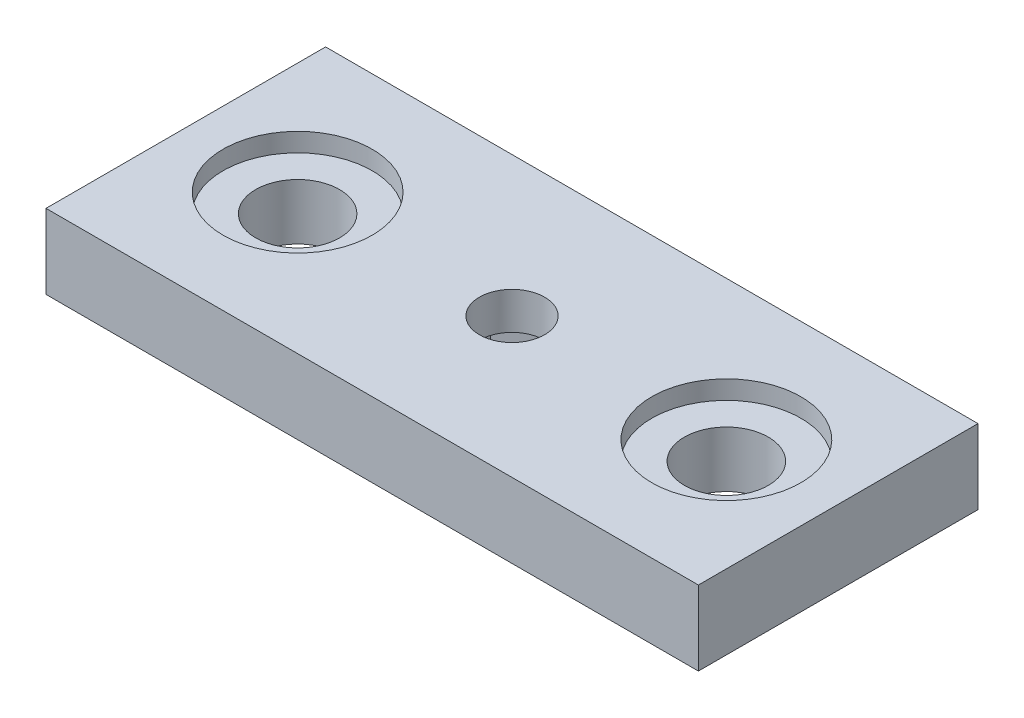
ISO-10303-21;
HEADER;
FILE_DESCRIPTION(('STEP AP214'),'2;1');
FILE_NAME('part.step','',(''),(''),'','','');
FILE_SCHEMA(('AUTOMOTIVE_DESIGN { 1 0 10303 214 1 1 1 1 }'));
ENDSEC;
DATA;
#1=APPLICATION_CONTEXT('core data for automotive mechanical design processes');
#2=APPLICATION_PROTOCOL_DEFINITION('international standard','automotive_design',2000,#1);
#3=PRODUCT_CONTEXT('',#1,'mechanical');
#4=PRODUCT('Part','Part','',(#3));
#5=PRODUCT_RELATED_PRODUCT_CATEGORY('part','',(#4));
#6=PRODUCT_DEFINITION_FORMATION('','',#4);
#7=PRODUCT_DEFINITION_CONTEXT('part definition',#1,'design');
#8=PRODUCT_DEFINITION('design','',#6,#7);
#9=PRODUCT_DEFINITION_SHAPE('','',#8);
#10=(LENGTH_UNIT() NAMED_UNIT(*) SI_UNIT(.MILLI.,.METRE.));
#11=(NAMED_UNIT(*) PLANE_ANGLE_UNIT() SI_UNIT($,.RADIAN.));
#12=(NAMED_UNIT(*) SI_UNIT($,.STERADIAN.) SOLID_ANGLE_UNIT());
#13=UNCERTAINTY_MEASURE_WITH_UNIT(LENGTH_MEASURE(1.E-05),#10,'distance_accuracy_value','');
#14=(GEOMETRIC_REPRESENTATION_CONTEXT(3) GLOBAL_UNCERTAINTY_ASSIGNED_CONTEXT((#13)) GLOBAL_UNIT_ASSIGNED_CONTEXT((#10,
#11,#12)) REPRESENTATION_CONTEXT('',''));
#15=CARTESIAN_POINT('',(0.,0.,0.));
#16=DIRECTION('',(0.,0.,1.));
#17=DIRECTION('',(1.,0.,0.));
#18=AXIS2_PLACEMENT_3D('',#15,#16,#17);
#19=CARTESIAN_POINT('',(17.5,4.,-7.5));
#20=DIRECTION('',(0.,1.,0.));
#21=DIRECTION('',(0.,0.,1.));
#22=AXIS2_PLACEMENT_3D('',#19,#20,#21);
#23=CYLINDRICAL_SURFACE('',#22,1.74999999999999);
#24=CARTESIAN_POINT('',(17.5,4.,-7.5));
#25=DIRECTION('',(0.,1.,0.));
#26=DIRECTION('',(0.,0.,1.));
#27=AXIS2_PLACEMENT_3D('',#24,#25,#26);
#28=CIRCLE('',#27,1.74999999999999);
#29=CARTESIAN_POINT('',(17.5,4.,-5.75000000000001));
#30=VERTEX_POINT('',#29);
#31=EDGE_CURVE('E200',#30,#30,#28,.T.);
#32=ORIENTED_EDGE('',*,*,#31,.T.);
#33=EDGE_LOOP('',(#32));
#34=FACE_BOUND('',#33,.T.);
#35=CARTESIAN_POINT('',(17.5,2.,-7.5));
#36=DIRECTION('',(0.,-1.,0.));
#37=DIRECTION('',(0.,0.,-1.));
#38=AXIS2_PLACEMENT_3D('',#35,#36,#37);
#39=CIRCLE('',#38,1.74999999999999);
#40=CARTESIAN_POINT('',(17.5,2.,-9.24999999999999));
#41=VERTEX_POINT('',#40);
#42=EDGE_CURVE('E38',#41,#41,#39,.F.);
#43=ORIENTED_EDGE('',*,*,#42,.F.);
#44=EDGE_LOOP('',(#43));
#45=FACE_BOUND('',#44,.T.);
#46=ADVANCED_FACE('F34',(#34,#45),#23,.F.);
#47=CARTESIAN_POINT('',(0.,4.,0.));
#48=DIRECTION('',(1.,0.,0.));
#49=DIRECTION('',(0.,0.,-1.));
#50=AXIS2_PLACEMENT_3D('',#47,#48,#49);
#51=PLANE('',#50);
#52=DIRECTION('',(0.,0.,1.));
#53=VECTOR('',#52,1.);
#54=CARTESIAN_POINT('',(0.,0.,0.));
#55=LINE('',#54,#53);
#56=CARTESIAN_POINT('',(0.,0.,-15.));
#57=VERTEX_POINT('',#56);
#58=CARTESIAN_POINT('',(0.,0.,0.));
#59=VERTEX_POINT('',#58);
#60=EDGE_CURVE('E203',#57,#59,#55,.T.);
#61=ORIENTED_EDGE('',*,*,#60,.T.);
#62=DIRECTION('',(0.,-1.,0.));
#63=VECTOR('',#62,1.);
#64=CARTESIAN_POINT('',(0.,4.,0.));
#65=LINE('',#64,#63);
#66=CARTESIAN_POINT('',(0.,4.,0.));
#67=VERTEX_POINT('',#66);
#68=EDGE_CURVE('E11',#67,#59,#65,.T.);
#69=ORIENTED_EDGE('',*,*,#68,.F.);
#70=DIRECTION('',(0.,0.,1.));
#71=VECTOR('',#70,1.);
#72=CARTESIAN_POINT('',(0.,4.,0.));
#73=LINE('',#72,#71);
#74=CARTESIAN_POINT('',(0.,4.,-15.));
#75=VERTEX_POINT('',#74);
#76=EDGE_CURVE('E204',#75,#67,#73,.T.);
#77=ORIENTED_EDGE('',*,*,#76,.F.);
#78=DIRECTION('',(0.,-1.,0.));
#79=VECTOR('',#78,1.);
#80=CARTESIAN_POINT('',(0.,4.,-15.));
#81=LINE('',#80,#79);
#82=EDGE_CURVE('E210',#75,#57,#81,.T.);
#83=ORIENTED_EDGE('',*,*,#82,.T.);
#84=EDGE_LOOP('',(#61,#69,#77,#83));
#85=FACE_BOUND('',#84,.T.);
#86=ADVANCED_FACE('F36',(#85),#51,.F.);
#87=CARTESIAN_POINT('',(0.,4.,0.));
#88=DIRECTION('',(0.,0.,-1.));
#89=DIRECTION('',(-1.,0.,0.));
#90=AXIS2_PLACEMENT_3D('',#87,#88,#89);
#91=PLANE('',#90);
#92=DIRECTION('',(1.,0.,0.));
#93=VECTOR('',#92,1.);
#94=CARTESIAN_POINT('',(0.,0.,0.));
#95=LINE('',#94,#93);
#96=CARTESIAN_POINT('',(35.,0.,0.));
#97=VERTEX_POINT('',#96);
#98=EDGE_CURVE('E213',#59,#97,#95,.T.);
#99=ORIENTED_EDGE('',*,*,#98,.T.);
#100=DIRECTION('',(0.,-1.,0.));
#101=VECTOR('',#100,1.);
#102=CARTESIAN_POINT('',(35.,4.,0.));
#103=LINE('',#102,#101);
#104=CARTESIAN_POINT('',(35.,4.,0.));
#105=VERTEX_POINT('',#104);
#106=EDGE_CURVE('E43',#105,#97,#103,.T.);
#107=ORIENTED_EDGE('',*,*,#106,.F.);
#108=DIRECTION('',(1.,0.,0.));
#109=VECTOR('',#108,1.);
#110=CARTESIAN_POINT('',(0.,4.,0.));
#111=LINE('',#110,#109);
#112=EDGE_CURVE('E87',#67,#105,#111,.T.);
#113=ORIENTED_EDGE('',*,*,#112,.F.);
#114=ORIENTED_EDGE('',*,*,#68,.T.);
#115=EDGE_LOOP('',(#99,#107,#113,#114));
#116=FACE_BOUND('',#115,.T.);
#117=ADVANCED_FACE('F243',(#116),#91,.F.);
#118=CARTESIAN_POINT('',(35.,4.,0.));
#119=DIRECTION('',(-1.,0.,0.));
#120=DIRECTION('',(0.,0.,1.));
#121=AXIS2_PLACEMENT_3D('',#118,#119,#120);
#122=PLANE('',#121);
#123=DIRECTION('',(0.,0.,-1.));
#124=VECTOR('',#123,1.);
#125=CARTESIAN_POINT('',(35.,0.,0.));
#126=LINE('',#125,#124);
#127=CARTESIAN_POINT('',(35.,0.,-15.));
#128=VERTEX_POINT('',#127);
#129=EDGE_CURVE('E215',#97,#128,#126,.T.);
#130=ORIENTED_EDGE('',*,*,#129,.T.);
#131=DIRECTION('',(0.,-1.,0.));
#132=VECTOR('',#131,1.);
#133=CARTESIAN_POINT('',(35.,4.,-15.));
#134=LINE('',#133,#132);
#135=CARTESIAN_POINT('',(35.,4.,-15.));
#136=VERTEX_POINT('',#135);
#137=EDGE_CURVE('E219',#136,#128,#134,.T.);
#138=ORIENTED_EDGE('',*,*,#137,.F.);
#139=DIRECTION('',(0.,0.,-1.));
#140=VECTOR('',#139,1.);
#141=CARTESIAN_POINT('',(35.,4.,0.));
#142=LINE('',#141,#140);
#143=EDGE_CURVE('E207',#105,#136,#142,.T.);
#144=ORIENTED_EDGE('',*,*,#143,.F.);
#145=ORIENTED_EDGE('',*,*,#106,.T.);
#146=EDGE_LOOP('',(#130,#138,#144,#145));
#147=FACE_BOUND('',#146,.T.);
#148=ADVANCED_FACE('F225',(#147),#122,.F.);
#149=CARTESIAN_POINT('',(0.,4.,-15.));
#150=DIRECTION('',(0.,0.,1.));
#151=DIRECTION('',(1.,0.,0.));
#152=AXIS2_PLACEMENT_3D('',#149,#150,#151);
#153=PLANE('',#152);
#154=DIRECTION('',(-1.,0.,0.));
#155=VECTOR('',#154,1.);
#156=CARTESIAN_POINT('',(0.,0.,-15.));
#157=LINE('',#156,#155);
#158=EDGE_CURVE('E80',#128,#57,#157,.T.);
#159=ORIENTED_EDGE('',*,*,#158,.T.);
#160=ORIENTED_EDGE('',*,*,#82,.F.);
#161=DIRECTION('',(-1.,0.,0.));
#162=VECTOR('',#161,1.);
#163=CARTESIAN_POINT('',(0.,4.,-15.));
#164=LINE('',#163,#162);
#165=EDGE_CURVE('E59',#136,#75,#164,.T.);
#166=ORIENTED_EDGE('',*,*,#165,.F.);
#167=ORIENTED_EDGE('',*,*,#137,.T.);
#168=EDGE_LOOP('',(#159,#160,#166,#167));
#169=FACE_BOUND('',#168,.T.);
#170=ADVANCED_FACE('F233',(#169),#153,.F.);
#171=CARTESIAN_POINT('',(0.,4.,0.));
#172=DIRECTION('',(0.,-1.,0.));
#173=DIRECTION('',(0.,0.,-1.));
#174=AXIS2_PLACEMENT_3D('',#171,#172,#173);
#175=PLANE('',#174);
#176=CARTESIAN_POINT('',(6.,4.,-7.5));
#177=DIRECTION('',(0.,1.,0.));
#178=DIRECTION('',(0.,0.,1.));
#179=AXIS2_PLACEMENT_3D('',#176,#177,#178);
#180=CIRCLE('',#179,4.);
#181=CARTESIAN_POINT('',(6.,4.,-3.5));
#182=VERTEX_POINT('',#181);
#183=EDGE_CURVE('E176',#182,#182,#180,.T.);
#184=ORIENTED_EDGE('',*,*,#183,.F.);
#185=EDGE_LOOP('',(#184));
#186=FACE_BOUND('',#185,.T.);
#187=CARTESIAN_POINT('',(29.,4.,-7.5));
#188=DIRECTION('',(0.,1.,0.));
#189=DIRECTION('',(0.,0.,1.));
#190=AXIS2_PLACEMENT_3D('',#187,#188,#189);
#191=CIRCLE('',#190,4.);
#192=CARTESIAN_POINT('',(29.,4.,-3.5));
#193=VERTEX_POINT('',#192);
#194=EDGE_CURVE('E188',#193,#193,#191,.T.);
#195=ORIENTED_EDGE('',*,*,#194,.F.);
#196=EDGE_LOOP('',(#195));
#197=FACE_BOUND('',#196,.T.);
#198=ORIENTED_EDGE('',*,*,#31,.F.);
#199=EDGE_LOOP('',(#198));
#200=FACE_BOUND('',#199,.T.);
#201=ORIENTED_EDGE('',*,*,#76,.T.);
#202=ORIENTED_EDGE('',*,*,#112,.T.);
#203=ORIENTED_EDGE('',*,*,#143,.T.);
#204=ORIENTED_EDGE('',*,*,#165,.T.);
#205=EDGE_LOOP('',(#201,#202,#203,#204));
#206=FACE_BOUND('',#205,.T.);
#207=ADVANCED_FACE('F235',(#186,#197,#200,#206),#175,.F.);
#208=CARTESIAN_POINT('',(0.,0.,0.));
#209=DIRECTION('',(0.,-1.,0.));
#210=DIRECTION('',(0.,0.,-1.));
#211=AXIS2_PLACEMENT_3D('',#208,#209,#210);
#212=PLANE('',#211);
#213=DIRECTION('',(0.866025403784438,0.,-0.5));
#214=VECTOR('',#213,1.);
#215=CARTESIAN_POINT('',(14.75,0.,-9.08771324027147));
#216=LINE('',#215,#214);
#217=CARTESIAN_POINT('',(14.75,0.,-9.08771324027147));
#218=VERTEX_POINT('',#217);
#219=CARTESIAN_POINT('',(17.5,0.,-10.6754264805429));
#220=VERTEX_POINT('',#219);
#221=EDGE_CURVE('E50',#218,#220,#216,.T.);
#222=ORIENTED_EDGE('',*,*,#221,.F.);
#223=DIRECTION('',(0.,0.,-1.));
#224=VECTOR('',#223,1.);
#225=CARTESIAN_POINT('',(14.75,0.,-5.91228675972853));
#226=LINE('',#225,#224);
#227=CARTESIAN_POINT('',(14.75,0.,-5.91228675972853));
#228=VERTEX_POINT('',#227);
#229=EDGE_CURVE('E143',#228,#218,#226,.T.);
#230=ORIENTED_EDGE('',*,*,#229,.F.);
#231=DIRECTION('',(-0.866025403784439,0.,-0.5));
#232=VECTOR('',#231,1.);
#233=CARTESIAN_POINT('',(17.5,0.,-4.32457351945706));
#234=LINE('',#233,#232);
#235=CARTESIAN_POINT('',(17.5,0.,-4.32457351945706));
#236=VERTEX_POINT('',#235);
#237=EDGE_CURVE('E146',#236,#228,#234,.T.);
#238=ORIENTED_EDGE('',*,*,#237,.F.);
#239=DIRECTION('',(-0.866025403784439,0.,0.5));
#240=VECTOR('',#239,1.);
#241=CARTESIAN_POINT('',(20.25,0.,-5.91228675972853));
#242=LINE('',#241,#240);
#243=CARTESIAN_POINT('',(20.25,0.,-5.91228675972853));
#244=VERTEX_POINT('',#243);
#245=EDGE_CURVE('E162',#244,#236,#242,.T.);
#246=ORIENTED_EDGE('',*,*,#245,.F.);
#247=DIRECTION('',(0.,0.,1.));
#248=VECTOR('',#247,1.);
#249=CARTESIAN_POINT('',(20.25,0.,-9.08771324027147));
#250=LINE('',#249,#248);
#251=CARTESIAN_POINT('',(20.25,0.,-9.08771324027147));
#252=VERTEX_POINT('',#251);
#253=EDGE_CURVE('E159',#252,#244,#250,.T.);
#254=ORIENTED_EDGE('',*,*,#253,.F.);
#255=DIRECTION('',(0.866025403784439,0.,0.5));
#256=VECTOR('',#255,1.);
#257=CARTESIAN_POINT('',(17.5,0.,-10.6754264805429));
#258=LINE('',#257,#256);
#259=EDGE_CURVE('E157',#220,#252,#258,.T.);
#260=ORIENTED_EDGE('',*,*,#259,.F.);
#261=EDGE_LOOP('',(#222,#230,#238,#246,#254,#260));
#262=FACE_BOUND('',#261,.T.);
#263=CARTESIAN_POINT('',(6.,0.,-7.5));
#264=DIRECTION('',(0.,1.,0.));
#265=DIRECTION('',(0.,0.,1.));
#266=AXIS2_PLACEMENT_3D('',#263,#264,#265);
#267=CIRCLE('',#266,2.25);
#268=CARTESIAN_POINT('',(6.,0.,-5.25));
#269=VERTEX_POINT('',#268);
#270=EDGE_CURVE('E185',#269,#269,#267,.T.);
#271=ORIENTED_EDGE('',*,*,#270,.T.);
#272=EDGE_LOOP('',(#271));
#273=FACE_BOUND('',#272,.T.);
#274=CARTESIAN_POINT('',(29.,0.,-7.5));
#275=DIRECTION('',(0.,1.,0.));
#276=DIRECTION('',(0.,0.,1.));
#277=AXIS2_PLACEMENT_3D('',#274,#275,#276);
#278=CIRCLE('',#277,2.25);
#279=CARTESIAN_POINT('',(29.,0.,-5.25));
#280=VERTEX_POINT('',#279);
#281=EDGE_CURVE('E197',#280,#280,#278,.T.);
#282=ORIENTED_EDGE('',*,*,#281,.T.);
#283=EDGE_LOOP('',(#282));
#284=FACE_BOUND('',#283,.T.);
#285=ORIENTED_EDGE('',*,*,#60,.F.);
#286=ORIENTED_EDGE('',*,*,#158,.F.);
#287=ORIENTED_EDGE('',*,*,#129,.F.);
#288=ORIENTED_EDGE('',*,*,#98,.F.);
#289=EDGE_LOOP('',(#285,#286,#287,#288));
#290=FACE_BOUND('',#289,.T.);
#291=ADVANCED_FACE('F229',(#262,#273,#284,#290),#212,.T.);
#292=CARTESIAN_POINT('',(29.,4.,-7.5));
#293=DIRECTION('',(0.,1.,0.));
#294=DIRECTION('',(0.,0.,1.));
#295=AXIS2_PLACEMENT_3D('',#292,#293,#294);
#296=CYLINDRICAL_SURFACE('',#295,2.25000000000001);
#297=ORIENTED_EDGE('',*,*,#281,.F.);
#298=EDGE_LOOP('',(#297));
#299=FACE_BOUND('',#298,.T.);
#300=CARTESIAN_POINT('',(29.,3.00000000000005,-7.5));
#301=DIRECTION('',(0.,1.,0.));
#302=DIRECTION('',(0.,0.,1.));
#303=AXIS2_PLACEMENT_3D('',#300,#301,#302);
#304=CIRCLE('',#303,2.25000000000001);
#305=CARTESIAN_POINT('',(29.,3.00000000000005,-5.24999999999999));
#306=VERTEX_POINT('',#305);
#307=EDGE_CURVE('E194',#306,#306,#304,.T.);
#308=ORIENTED_EDGE('',*,*,#307,.T.);
#309=EDGE_LOOP('',(#308));
#310=FACE_BOUND('',#309,.T.);
#311=ADVANCED_FACE('F254',(#299,#310),#296,.F.);
#312=CARTESIAN_POINT('',(31.25,3.00000000000003,-7.5));
#313=DIRECTION('',(0.,-1.,0.));
#314=DIRECTION('',(0.,0.,-1.));
#315=AXIS2_PLACEMENT_3D('',#312,#313,#314);
#316=PLANE('',#315);
#317=ORIENTED_EDGE('',*,*,#307,.F.);
#318=EDGE_LOOP('',(#317));
#319=FACE_BOUND('',#318,.T.);
#320=CARTESIAN_POINT('',(29.,3.,-7.5));
#321=DIRECTION('',(0.,1.,0.));
#322=DIRECTION('',(0.,0.,1.));
#323=AXIS2_PLACEMENT_3D('',#320,#321,#322);
#324=CIRCLE('',#323,4.);
#325=CARTESIAN_POINT('',(29.,3.,-3.5));
#326=VERTEX_POINT('',#325);
#327=EDGE_CURVE('E191',#326,#326,#324,.T.);
#328=ORIENTED_EDGE('',*,*,#327,.T.);
#329=EDGE_LOOP('',(#328));
#330=FACE_BOUND('',#329,.T.);
#331=ADVANCED_FACE('F261',(#319,#330),#316,.F.);
#332=CARTESIAN_POINT('',(29.,4.,-7.5));
#333=DIRECTION('',(0.,1.,0.));
#334=DIRECTION('',(0.,0.,1.));
#335=AXIS2_PLACEMENT_3D('',#332,#333,#334);
#336=CYLINDRICAL_SURFACE('',#335,4.);
#337=ORIENTED_EDGE('',*,*,#327,.F.);
#338=EDGE_LOOP('',(#337));
#339=FACE_BOUND('',#338,.T.);
#340=ORIENTED_EDGE('',*,*,#194,.T.);
#341=EDGE_LOOP('',(#340));
#342=FACE_BOUND('',#341,.T.);
#343=ADVANCED_FACE('F273',(#339,#342),#336,.F.);
#344=CARTESIAN_POINT('',(6.,4.,-7.5));
#345=DIRECTION('',(0.,1.,0.));
#346=DIRECTION('',(0.,0.,1.));
#347=AXIS2_PLACEMENT_3D('',#344,#345,#346);
#348=CYLINDRICAL_SURFACE('',#347,2.25);
#349=ORIENTED_EDGE('',*,*,#270,.F.);
#350=EDGE_LOOP('',(#349));
#351=FACE_BOUND('',#350,.T.);
#352=CARTESIAN_POINT('',(6.,3.00000000000005,-7.5));
#353=DIRECTION('',(0.,1.,0.));
#354=DIRECTION('',(0.,0.,1.));
#355=AXIS2_PLACEMENT_3D('',#352,#353,#354);
#356=CIRCLE('',#355,2.25000000000001);
#357=CARTESIAN_POINT('',(6.,3.00000000000005,-5.24999999999999));
#358=VERTEX_POINT('',#357);
#359=EDGE_CURVE('E182',#358,#358,#356,.T.);
#360=ORIENTED_EDGE('',*,*,#359,.T.);
#361=EDGE_LOOP('',(#360));
#362=FACE_BOUND('',#361,.T.);
#363=ADVANCED_FACE('F278',(#351,#362),#348,.F.);
#364=CARTESIAN_POINT('',(8.25000000000001,3.00000000000003,-7.5));
#365=DIRECTION('',(0.,-1.,0.));
#366=DIRECTION('',(0.,0.,-1.));
#367=AXIS2_PLACEMENT_3D('',#364,#365,#366);
#368=PLANE('',#367);
#369=ORIENTED_EDGE('',*,*,#359,.F.);
#370=EDGE_LOOP('',(#369));
#371=FACE_BOUND('',#370,.T.);
#372=CARTESIAN_POINT('',(6.,3.,-7.5));
#373=DIRECTION('',(0.,1.,0.));
#374=DIRECTION('',(0.,0.,1.));
#375=AXIS2_PLACEMENT_3D('',#372,#373,#374);
#376=CIRCLE('',#375,4.);
#377=CARTESIAN_POINT('',(6.,3.,-3.5));
#378=VERTEX_POINT('',#377);
#379=EDGE_CURVE('E179',#378,#378,#376,.T.);
#380=ORIENTED_EDGE('',*,*,#379,.T.);
#381=EDGE_LOOP('',(#380));
#382=FACE_BOUND('',#381,.T.);
#383=ADVANCED_FACE('F287',(#371,#382),#368,.F.);
#384=CARTESIAN_POINT('',(6.,4.,-7.5));
#385=DIRECTION('',(0.,1.,0.));
#386=DIRECTION('',(0.,0.,1.));
#387=AXIS2_PLACEMENT_3D('',#384,#385,#386);
#388=CYLINDRICAL_SURFACE('',#387,4.);
#389=ORIENTED_EDGE('',*,*,#379,.F.);
#390=EDGE_LOOP('',(#389));
#391=FACE_BOUND('',#390,.T.);
#392=ORIENTED_EDGE('',*,*,#183,.T.);
#393=EDGE_LOOP('',(#392));
#394=FACE_BOUND('',#393,.T.);
#395=ADVANCED_FACE('F293',(#391,#394),#388,.F.);
#396=CARTESIAN_POINT('',(0.,2.,0.));
#397=DIRECTION('',(0.,-1.,0.));
#398=DIRECTION('',(0.,0.,-1.));
#399=AXIS2_PLACEMENT_3D('',#396,#397,#398);
#400=PLANE('',#399);
#401=DIRECTION('',(0.866025403784438,0.,-0.5));
#402=VECTOR('',#401,1.);
#403=CARTESIAN_POINT('',(14.75,2.,-9.08771324027147));
#404=LINE('',#403,#402);
#405=CARTESIAN_POINT('',(14.75,2.,-9.08771324027147));
#406=VERTEX_POINT('',#405);
#407=CARTESIAN_POINT('',(17.5,2.,-10.6754264805429));
#408=VERTEX_POINT('',#407);
#409=EDGE_CURVE('E123',#406,#408,#404,.T.);
#410=ORIENTED_EDGE('',*,*,#409,.T.);
#411=DIRECTION('',(0.866025403784439,0.,0.5));
#412=VECTOR('',#411,1.);
#413=CARTESIAN_POINT('',(17.5,2.,-10.6754264805429));
#414=LINE('',#413,#412);
#415=CARTESIAN_POINT('',(20.25,2.,-9.08771324027147));
#416=VERTEX_POINT('',#415);
#417=EDGE_CURVE('E132',#408,#416,#414,.T.);
#418=ORIENTED_EDGE('',*,*,#417,.T.);
#419=DIRECTION('',(0.,0.,1.));
#420=VECTOR('',#419,1.);
#421=CARTESIAN_POINT('',(20.25,2.,-9.08771324027147));
#422=LINE('',#421,#420);
#423=CARTESIAN_POINT('',(20.25,2.,-5.91228675972853));
#424=VERTEX_POINT('',#423);
#425=EDGE_CURVE('E137',#416,#424,#422,.T.);
#426=ORIENTED_EDGE('',*,*,#425,.T.);
#427=DIRECTION('',(-0.866025403784439,0.,0.5));
#428=VECTOR('',#427,1.);
#429=CARTESIAN_POINT('',(20.25,2.,-5.91228675972853));
#430=LINE('',#429,#428);
#431=CARTESIAN_POINT('',(17.5,2.,-4.32457351945706));
#432=VERTEX_POINT('',#431);
#433=EDGE_CURVE('E150',#424,#432,#430,.T.);
#434=ORIENTED_EDGE('',*,*,#433,.T.);
#435=DIRECTION('',(-0.866025403784439,0.,-0.5));
#436=VECTOR('',#435,1.);
#437=CARTESIAN_POINT('',(17.5,2.,-4.32457351945706));
#438=LINE('',#437,#436);
#439=CARTESIAN_POINT('',(14.75,2.,-5.91228675972853));
#440=VERTEX_POINT('',#439);
#441=EDGE_CURVE('E153',#432,#440,#438,.T.);
#442=ORIENTED_EDGE('',*,*,#441,.T.);
#443=DIRECTION('',(0.,0.,-1.));
#444=VECTOR('',#443,1.);
#445=CARTESIAN_POINT('',(14.75,2.,-5.91228675972853));
#446=LINE('',#445,#444);
#447=EDGE_CURVE('E129',#440,#406,#446,.T.);
#448=ORIENTED_EDGE('',*,*,#447,.T.);
#449=EDGE_LOOP('',(#410,#418,#426,#434,#442,#448));
#450=FACE_BOUND('',#449,.T.);
#451=ORIENTED_EDGE('',*,*,#42,.T.);
#452=EDGE_LOOP('',(#451));
#453=FACE_BOUND('',#452,.T.);
#454=ADVANCED_FACE('F139',(#450,#453),#400,.T.);
#455=CARTESIAN_POINT('',(14.75,2.,-9.08771324027147));
#456=DIRECTION('',(-0.5,0.,-0.866025403784438));
#457=DIRECTION('',(-0.866025403784439,0.,0.5));
#458=AXIS2_PLACEMENT_3D('',#455,#456,#457);
#459=PLANE('',#458);
#460=ORIENTED_EDGE('',*,*,#221,.T.);
#461=DIRECTION('',(0.,-1.,0.));
#462=VECTOR('',#461,1.);
#463=CARTESIAN_POINT('',(17.5,2.,-10.6754264805429));
#464=LINE('',#463,#462);
#465=EDGE_CURVE('E119',#408,#220,#464,.T.);
#466=ORIENTED_EDGE('',*,*,#465,.F.);
#467=ORIENTED_EDGE('',*,*,#409,.F.);
#468=DIRECTION('',(0.,-1.,0.));
#469=VECTOR('',#468,1.);
#470=CARTESIAN_POINT('',(14.75,2.,-9.08771324027147));
#471=LINE('',#470,#469);
#472=EDGE_CURVE('E167',#406,#218,#471,.T.);
#473=ORIENTED_EDGE('',*,*,#472,.T.);
#474=EDGE_LOOP('',(#460,#466,#467,#473));
#475=FACE_BOUND('',#474,.T.);
#476=ADVANCED_FACE('F121',(#475),#459,.F.);
#477=CARTESIAN_POINT('',(14.75,2.,-5.91228675972853));
#478=DIRECTION('',(-1.,0.,0.));
#479=DIRECTION('',(0.,0.,1.));
#480=AXIS2_PLACEMENT_3D('',#477,#478,#479);
#481=PLANE('',#480);
#482=ORIENTED_EDGE('',*,*,#229,.T.);
#483=ORIENTED_EDGE('',*,*,#472,.F.);
#484=ORIENTED_EDGE('',*,*,#447,.F.);
#485=DIRECTION('',(0.,-1.,0.));
#486=VECTOR('',#485,1.);
#487=CARTESIAN_POINT('',(14.75,2.,-5.91228675972853));
#488=LINE('',#487,#486);
#489=EDGE_CURVE('E169',#440,#228,#488,.T.);
#490=ORIENTED_EDGE('',*,*,#489,.T.);
#491=EDGE_LOOP('',(#482,#483,#484,#490));
#492=FACE_BOUND('',#491,.T.);
#493=ADVANCED_FACE('F300',(#492),#481,.F.);
#494=CARTESIAN_POINT('',(17.5,2.,-4.32457351945706));
#495=DIRECTION('',(-0.5,0.,0.866025403784439));
#496=DIRECTION('',(0.866025403784439,0.,0.5));
#497=AXIS2_PLACEMENT_3D('',#494,#495,#496);
#498=PLANE('',#497);
#499=ORIENTED_EDGE('',*,*,#237,.T.);
#500=ORIENTED_EDGE('',*,*,#489,.F.);
#501=ORIENTED_EDGE('',*,*,#441,.F.);
#502=DIRECTION('',(0.,-1.,0.));
#503=VECTOR('',#502,1.);
#504=CARTESIAN_POINT('',(17.5,2.,-4.32457351945706));
#505=LINE('',#504,#503);
#506=EDGE_CURVE('E171',#432,#236,#505,.T.);
#507=ORIENTED_EDGE('',*,*,#506,.T.);
#508=EDGE_LOOP('',(#499,#500,#501,#507));
#509=FACE_BOUND('',#508,.T.);
#510=ADVANCED_FACE('F310',(#509),#498,.F.);
#511=CARTESIAN_POINT('',(20.25,2.,-5.91228675972853));
#512=DIRECTION('',(0.5,0.,0.866025403784439));
#513=DIRECTION('',(0.866025403784439,0.,-0.5));
#514=AXIS2_PLACEMENT_3D('',#511,#512,#513);
#515=PLANE('',#514);
#516=ORIENTED_EDGE('',*,*,#245,.T.);
#517=ORIENTED_EDGE('',*,*,#506,.F.);
#518=ORIENTED_EDGE('',*,*,#433,.F.);
#519=DIRECTION('',(0.,-1.,0.));
#520=VECTOR('',#519,1.);
#521=CARTESIAN_POINT('',(20.25,2.,-5.91228675972853));
#522=LINE('',#521,#520);
#523=EDGE_CURVE('E173',#424,#244,#522,.T.);
#524=ORIENTED_EDGE('',*,*,#523,.T.);
#525=EDGE_LOOP('',(#516,#517,#518,#524));
#526=FACE_BOUND('',#525,.T.);
#527=ADVANCED_FACE('F306',(#526),#515,.F.);
#528=CARTESIAN_POINT('',(20.25,2.,-9.08771324027147));
#529=DIRECTION('',(1.,0.,0.));
#530=DIRECTION('',(0.,0.,-1.));
#531=AXIS2_PLACEMENT_3D('',#528,#529,#530);
#532=PLANE('',#531);
#533=ORIENTED_EDGE('',*,*,#253,.T.);
#534=ORIENTED_EDGE('',*,*,#523,.F.);
#535=ORIENTED_EDGE('',*,*,#425,.F.);
#536=DIRECTION('',(0.,-1.,0.));
#537=VECTOR('',#536,1.);
#538=CARTESIAN_POINT('',(20.25,2.,-9.08771324027147));
#539=LINE('',#538,#537);
#540=EDGE_CURVE('E128',#416,#252,#539,.T.);
#541=ORIENTED_EDGE('',*,*,#540,.T.);
#542=EDGE_LOOP('',(#533,#534,#535,#541));
#543=FACE_BOUND('',#542,.T.);
#544=ADVANCED_FACE('F303',(#543),#532,.F.);
#545=CARTESIAN_POINT('',(17.5,2.,-10.6754264805429));
#546=DIRECTION('',(0.5,0.,-0.866025403784439));
#547=DIRECTION('',(-0.866025403784439,0.,-0.5));
#548=AXIS2_PLACEMENT_3D('',#545,#546,#547);
#549=PLANE('',#548);
#550=ORIENTED_EDGE('',*,*,#259,.T.);
#551=ORIENTED_EDGE('',*,*,#540,.F.);
#552=ORIENTED_EDGE('',*,*,#417,.F.);
#553=ORIENTED_EDGE('',*,*,#465,.T.);
#554=EDGE_LOOP('',(#550,#551,#552,#553));
#555=FACE_BOUND('',#554,.T.);
#556=ADVANCED_FACE('F133',(#555),#549,.F.);
#557=CLOSED_SHELL('',(#46,#86,#117,#148,#170,#207,#291,#311,#331,#343,#363,#383,#395,#454,#476,
#493,#510,#527,#544,#556));
#558=MANIFOLD_SOLID_BREP('B2',#557);
#559=ADVANCED_BREP_SHAPE_REPRESENTATION('',(#18,#558),#14);
#560=SHAPE_DEFINITION_REPRESENTATION(#9,#559);
ENDSEC;
END-ISO-10303-21;
